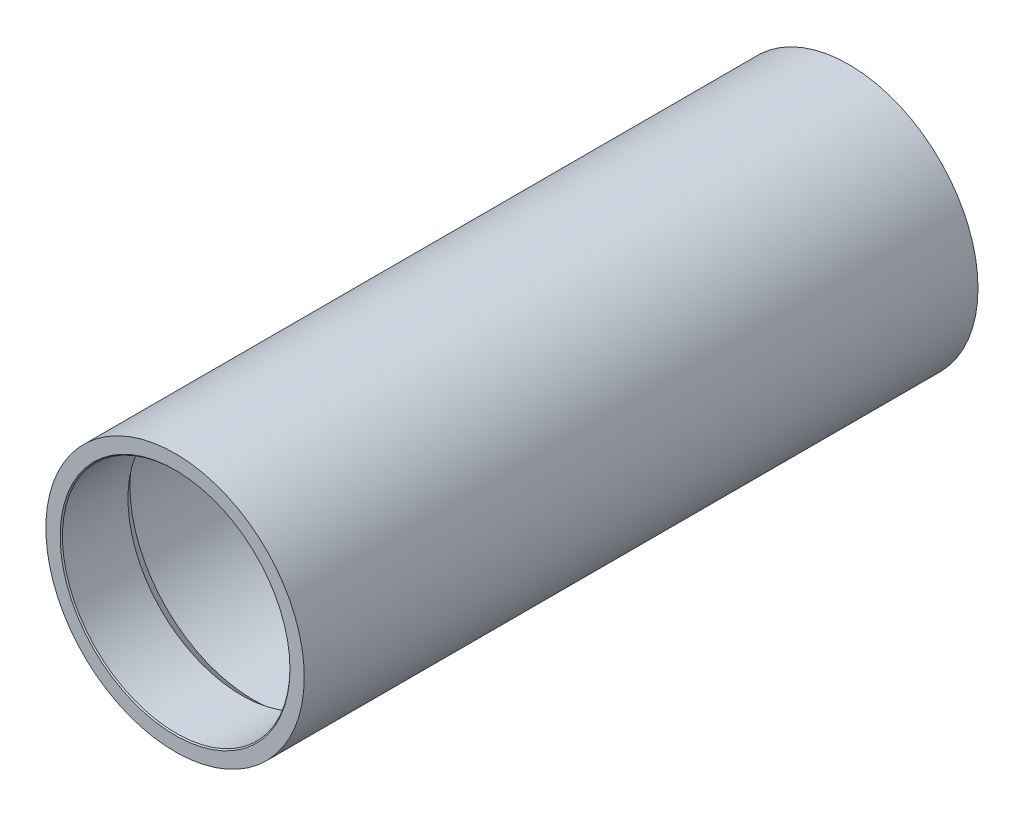
ISO-10303-21;
HEADER;
FILE_DESCRIPTION(('STEP AP214'),'2;1');
FILE_NAME('part.step','',(''),(''),'','','');
FILE_SCHEMA(('AUTOMOTIVE_DESIGN { 1 0 10303 214 1 1 1 1 }'));
ENDSEC;
DATA;
#1=APPLICATION_CONTEXT('core data for automotive mechanical design processes');
#2=APPLICATION_PROTOCOL_DEFINITION('international standard','automotive_design',2000,#1);
#3=PRODUCT_CONTEXT('',#1,'mechanical');
#4=PRODUCT('Part','Part','',(#3));
#5=PRODUCT_RELATED_PRODUCT_CATEGORY('part','',(#4));
#6=PRODUCT_DEFINITION_FORMATION('','',#4);
#7=PRODUCT_DEFINITION_CONTEXT('part definition',#1,'design');
#8=PRODUCT_DEFINITION('design','',#6,#7);
#9=PRODUCT_DEFINITION_SHAPE('','',#8);
#10=(LENGTH_UNIT() NAMED_UNIT(*) SI_UNIT(.MILLI.,.METRE.));
#11=(NAMED_UNIT(*) PLANE_ANGLE_UNIT() SI_UNIT($,.RADIAN.));
#12=(NAMED_UNIT(*) SI_UNIT($,.STERADIAN.) SOLID_ANGLE_UNIT());
#13=UNCERTAINTY_MEASURE_WITH_UNIT(LENGTH_MEASURE(1.E-05),#10,'distance_accuracy_value','');
#14=(GEOMETRIC_REPRESENTATION_CONTEXT(3) GLOBAL_UNCERTAINTY_ASSIGNED_CONTEXT((#13)) GLOBAL_UNIT_ASSIGNED_CONTEXT((#10,
#11,#12)) REPRESENTATION_CONTEXT('',''));
#15=CARTESIAN_POINT('',(0.,0.,0.));
#16=DIRECTION('',(0.,0.,1.));
#17=DIRECTION('',(1.,0.,0.));
#18=AXIS2_PLACEMENT_3D('',#15,#16,#17);
#19=CARTESIAN_POINT('',(0.,0.,-297.5));
#20=DIRECTION('',(0.,0.,1.));
#21=DIRECTION('',(1.,0.,0.));
#22=AXIS2_PLACEMENT_3D('',#19,#20,#21);
#23=CYLINDRICAL_SURFACE('',#22,50.325);
#24=CARTESIAN_POINT('',(0.,0.,-268.5));
#25=DIRECTION('',(0.,0.,1.));
#26=DIRECTION('',(1.,0.,0.));
#27=AXIS2_PLACEMENT_3D('',#24,#25,#26);
#28=CIRCLE('',#27,50.325);
#29=CARTESIAN_POINT('',(50.325,0.,-268.5));
#30=VERTEX_POINT('',#29);
#31=EDGE_CURVE('E36',#30,#30,#28,.F.);
#32=ORIENTED_EDGE('',*,*,#31,.F.);
#33=EDGE_LOOP('',(#32));
#34=FACE_BOUND('',#33,.T.);
#35=CARTESIAN_POINT('',(0.,0.,-297.5));
#36=DIRECTION('',(0.,0.,-1.));
#37=DIRECTION('',(-1.,0.,0.));
#38=AXIS2_PLACEMENT_3D('',#35,#36,#37);
#39=CIRCLE('',#38,50.325);
#40=CARTESIAN_POINT('',(-50.325,0.,-297.5));
#41=VERTEX_POINT('',#40);
#42=EDGE_CURVE('E63',#41,#41,#39,.F.);
#43=ORIENTED_EDGE('',*,*,#42,.F.);
#44=EDGE_LOOP('',(#43));
#45=FACE_BOUND('',#44,.T.);
#46=ADVANCED_FACE('F15',(#34,#45),#23,.F.);
#47=CARTESIAN_POINT('',(0.,0.,-268.5));
#48=DIRECTION('',(0.,0.,1.));
#49=DIRECTION('',(0.,-1.,0.));
#50=AXIS2_PLACEMENT_3D('',#47,#48,#49);
#51=CONICAL_SURFACE('',#50,50.325,0.698131700819148);
#52=CARTESIAN_POINT('',(0.,0.,-263.226490353));
#53=DIRECTION('',(0.,0.,1.));
#54=DIRECTION('',(1.,0.,0.));
#55=AXIS2_PLACEMENT_3D('',#52,#53,#54);
#56=CIRCLE('',#55,54.75);
#57=CARTESIAN_POINT('',(54.75,0.,-263.226490353));
#58=VERTEX_POINT('',#57);
#59=EDGE_CURVE('E59',#58,#58,#56,.F.);
#60=ORIENTED_EDGE('',*,*,#59,.F.);
#61=EDGE_LOOP('',(#60));
#62=FACE_BOUND('',#61,.T.);
#63=ORIENTED_EDGE('',*,*,#31,.T.);
#64=EDGE_LOOP('',(#63));
#65=FACE_BOUND('',#64,.T.);
#66=ADVANCED_FACE('F75',(#62,#65),#51,.F.);
#67=CARTESIAN_POINT('',(0.,0.,-297.5));
#68=DIRECTION('',(0.,0.,-1.));
#69=DIRECTION('',(-1.,0.,0.));
#70=AXIS2_PLACEMENT_3D('',#67,#68,#69);
#71=CONICAL_SURFACE('',#70,50.325,0.785398163397448);
#72=CARTESIAN_POINT('',(0.,0.,-298.));
#73=DIRECTION('',(0.,0.,-1.));
#74=DIRECTION('',(-1.,0.,0.));
#75=AXIS2_PLACEMENT_3D('',#72,#73,#74);
#76=CIRCLE('',#75,50.825);
#77=CARTESIAN_POINT('',(-50.825,0.,-298.));
#78=VERTEX_POINT('',#77);
#79=EDGE_CURVE('E19',#78,#78,#76,.T.);
#80=ORIENTED_EDGE('',*,*,#79,.T.);
#81=EDGE_LOOP('',(#80));
#82=FACE_BOUND('',#81,.T.);
#83=ORIENTED_EDGE('',*,*,#42,.T.);
#84=EDGE_LOOP('',(#83));
#85=FACE_BOUND('',#84,.T.);
#86=ADVANCED_FACE('F84',(#82,#85),#71,.F.);
#87=CARTESIAN_POINT('',(0.,0.,-263.226490353));
#88=DIRECTION('',(0.,0.,1.));
#89=DIRECTION('',(1.,0.,0.));
#90=AXIS2_PLACEMENT_3D('',#87,#88,#89);
#91=CYLINDRICAL_SURFACE('',#90,54.75);
#92=CARTESIAN_POINT('',(0.,0.,-34.773509647));
#93=DIRECTION('',(0.,0.,-1.));
#94=DIRECTION('',(-1.,0.,0.));
#95=AXIS2_PLACEMENT_3D('',#92,#93,#94);
#96=CIRCLE('',#95,54.75);
#97=CARTESIAN_POINT('',(-54.75,0.,-34.773509647));
#98=VERTEX_POINT('',#97);
#99=EDGE_CURVE('E44',#98,#98,#96,.T.);
#100=ORIENTED_EDGE('',*,*,#99,.F.);
#101=EDGE_LOOP('',(#100));
#102=FACE_BOUND('',#101,.T.);
#103=ORIENTED_EDGE('',*,*,#59,.T.);
#104=EDGE_LOOP('',(#103));
#105=FACE_BOUND('',#104,.T.);
#106=ADVANCED_FACE('F108',(#102,#105),#91,.F.);
#107=CARTESIAN_POINT('',(-57.8358,-57.8358,-298.));
#108=DIRECTION('',(0.,0.,1.));
#109=DIRECTION('',(1.,0.,0.));
#110=AXIS2_PLACEMENT_3D('',#107,#108,#109);
#111=PLANE('',#110);
#112=ORIENTED_EDGE('',*,*,#79,.F.);
#113=EDGE_LOOP('',(#112));
#114=FACE_BOUND('',#113,.T.);
#115=CARTESIAN_POINT('',(0.,0.,-298.));
#116=DIRECTION('',(0.,0.,1.));
#117=DIRECTION('',(1.,0.,0.));
#118=AXIS2_PLACEMENT_3D('',#115,#116,#117);
#119=CIRCLE('',#118,57.15);
#120=CARTESIAN_POINT('',(57.15,0.,-298.));
#121=VERTEX_POINT('',#120);
#122=EDGE_CURVE('E41',#121,#121,#119,.F.);
#123=ORIENTED_EDGE('',*,*,#122,.T.);
#124=EDGE_LOOP('',(#123));
#125=FACE_BOUND('',#124,.T.);
#126=ADVANCED_FACE('F107',(#114,#125),#111,.F.);
#127=CARTESIAN_POINT('',(0.,0.,-29.5));
#128=DIRECTION('',(0.,0.,-1.));
#129=DIRECTION('',(0.,1.,0.));
#130=AXIS2_PLACEMENT_3D('',#127,#128,#129);
#131=CONICAL_SURFACE('',#130,50.325,0.698131700819149);
#132=ORIENTED_EDGE('',*,*,#99,.T.);
#133=EDGE_LOOP('',(#132));
#134=FACE_BOUND('',#133,.T.);
#135=CARTESIAN_POINT('',(0.,0.,-29.5));
#136=DIRECTION('',(0.,0.,1.));
#137=DIRECTION('',(1.,0.,0.));
#138=AXIS2_PLACEMENT_3D('',#135,#136,#137);
#139=CIRCLE('',#138,50.325);
#140=CARTESIAN_POINT('',(50.325,0.,-29.5));
#141=VERTEX_POINT('',#140);
#142=EDGE_CURVE('E40',#141,#141,#139,.F.);
#143=ORIENTED_EDGE('',*,*,#142,.F.);
#144=EDGE_LOOP('',(#143));
#145=FACE_BOUND('',#144,.T.);
#146=ADVANCED_FACE('F103',(#134,#145),#131,.F.);
#147=CARTESIAN_POINT('',(0.,0.,-298.));
#148=DIRECTION('',(0.,0.,1.));
#149=DIRECTION('',(1.,0.,0.));
#150=AXIS2_PLACEMENT_3D('',#147,#148,#149);
#151=CYLINDRICAL_SURFACE('',#150,57.15);
#152=CARTESIAN_POINT('',(0.,0.,0.));
#153=DIRECTION('',(0.,0.,1.));
#154=DIRECTION('',(1.,0.,0.));
#155=AXIS2_PLACEMENT_3D('',#152,#153,#154);
#156=CIRCLE('',#155,57.15);
#157=CARTESIAN_POINT('',(57.15,0.,0.));
#158=VERTEX_POINT('',#157);
#159=EDGE_CURVE('E32',#158,#158,#156,.F.);
#160=ORIENTED_EDGE('',*,*,#159,.T.);
#161=EDGE_LOOP('',(#160));
#162=FACE_BOUND('',#161,.T.);
#163=ORIENTED_EDGE('',*,*,#122,.F.);
#164=EDGE_LOOP('',(#163));
#165=FACE_BOUND('',#164,.T.);
#166=ADVANCED_FACE('F99',(#162,#165),#151,.T.);
#167=CARTESIAN_POINT('',(0.,0.,-29.5));
#168=DIRECTION('',(0.,0.,1.));
#169=DIRECTION('',(0.,-1.,0.));
#170=AXIS2_PLACEMENT_3D('',#167,#168,#169);
#171=CYLINDRICAL_SURFACE('',#170,50.325);
#172=CARTESIAN_POINT('',(0.,0.,-0.499999999999945));
#173=DIRECTION('',(0.,0.,1.));
#174=DIRECTION('',(1.,0.,0.));
#175=AXIS2_PLACEMENT_3D('',#172,#173,#174);
#176=CIRCLE('',#175,50.325);
#177=CARTESIAN_POINT('',(50.325,0.,-0.5));
#178=VERTEX_POINT('',#177);
#179=EDGE_CURVE('E24',#178,#178,#176,.F.);
#180=ORIENTED_EDGE('',*,*,#179,.F.);
#181=EDGE_LOOP('',(#180));
#182=FACE_BOUND('',#181,.T.);
#183=ORIENTED_EDGE('',*,*,#142,.T.);
#184=EDGE_LOOP('',(#183));
#185=FACE_BOUND('',#184,.T.);
#186=ADVANCED_FACE('F94',(#182,#185),#171,.F.);
#187=CARTESIAN_POINT('',(57.8358,-57.8358,0.));
#188=DIRECTION('',(0.,0.,-1.));
#189=DIRECTION('',(-1.,0.,0.));
#190=AXIS2_PLACEMENT_3D('',#187,#188,#189);
#191=PLANE('',#190);
#192=CARTESIAN_POINT('',(0.,0.,0.));
#193=DIRECTION('',(0.,0.,1.));
#194=DIRECTION('',(1.,0.,0.));
#195=AXIS2_PLACEMENT_3D('',#192,#193,#194);
#196=CIRCLE('',#195,50.825);
#197=CARTESIAN_POINT('',(50.825,0.,0.));
#198=VERTEX_POINT('',#197);
#199=EDGE_CURVE('E10',#198,#198,#196,.T.);
#200=ORIENTED_EDGE('',*,*,#199,.F.);
#201=EDGE_LOOP('',(#200));
#202=FACE_BOUND('',#201,.T.);
#203=ORIENTED_EDGE('',*,*,#159,.F.);
#204=EDGE_LOOP('',(#203));
#205=FACE_BOUND('',#204,.T.);
#206=ADVANCED_FACE('F17',(#202,#205),#191,.F.);
#207=CARTESIAN_POINT('',(0.,0.,-0.5));
#208=DIRECTION('',(0.,0.,1.));
#209=DIRECTION('',(1.,0.,0.));
#210=AXIS2_PLACEMENT_3D('',#207,#208,#209);
#211=CONICAL_SURFACE('',#210,50.325,0.785398163397449);
#212=ORIENTED_EDGE('',*,*,#179,.T.);
#213=EDGE_LOOP('',(#212));
#214=FACE_BOUND('',#213,.T.);
#215=ORIENTED_EDGE('',*,*,#199,.T.);
#216=EDGE_LOOP('',(#215));
#217=FACE_BOUND('',#216,.T.);
#218=ADVANCED_FACE('F87',(#214,#217),#211,.F.);
#219=CLOSED_SHELL('',(#46,#66,#86,#106,#126,#146,#166,#186,#206,#218));
#220=MANIFOLD_SOLID_BREP('B1',#219);
#221=ADVANCED_BREP_SHAPE_REPRESENTATION('',(#18,#220),#14);
#222=SHAPE_DEFINITION_REPRESENTATION(#9,#221);
ENDSEC;
END-ISO-10303-21;
